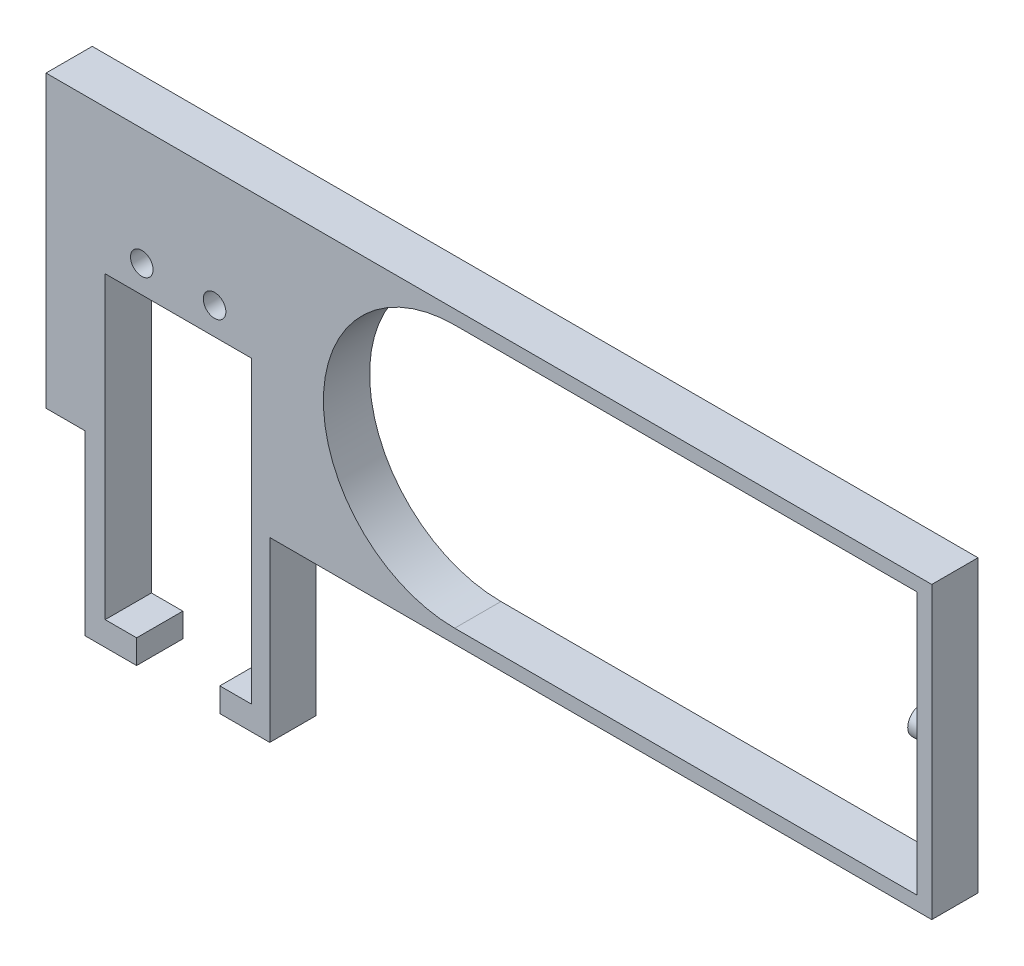
ISO-10303-21;
HEADER;
FILE_DESCRIPTION(('STEP AP214'),'2;1');
FILE_NAME('part.step','',(''),(''),'','','');
FILE_SCHEMA(('AUTOMOTIVE_DESIGN { 1 0 10303 214 1 1 1 1 }'));
ENDSEC;
DATA;
#1=APPLICATION_CONTEXT('core data for automotive mechanical design processes');
#2=APPLICATION_PROTOCOL_DEFINITION('international standard','automotive_design',2000,#1);
#3=PRODUCT_CONTEXT('',#1,'mechanical');
#4=PRODUCT('Part','Part','',(#3));
#5=PRODUCT_RELATED_PRODUCT_CATEGORY('part','',(#4));
#6=PRODUCT_DEFINITION_FORMATION('','',#4);
#7=PRODUCT_DEFINITION_CONTEXT('part definition',#1,'design');
#8=PRODUCT_DEFINITION('design','',#6,#7);
#9=PRODUCT_DEFINITION_SHAPE('','',#8);
#10=(LENGTH_UNIT() NAMED_UNIT(*) SI_UNIT(.MILLI.,.METRE.));
#11=(NAMED_UNIT(*) PLANE_ANGLE_UNIT() SI_UNIT($,.RADIAN.));
#12=(NAMED_UNIT(*) SI_UNIT($,.STERADIAN.) SOLID_ANGLE_UNIT());
#13=UNCERTAINTY_MEASURE_WITH_UNIT(LENGTH_MEASURE(1.E-05),#10,'distance_accuracy_value','');
#14=(GEOMETRIC_REPRESENTATION_CONTEXT(3) GLOBAL_UNCERTAINTY_ASSIGNED_CONTEXT((#13)) GLOBAL_UNIT_ASSIGNED_CONTEXT((#10,
#11,#12)) REPRESENTATION_CONTEXT('',''));
#15=CARTESIAN_POINT('',(0.,0.,0.));
#16=DIRECTION('',(0.,0.,1.));
#17=DIRECTION('',(1.,0.,0.));
#18=AXIS2_PLACEMENT_3D('',#15,#16,#17);
#19=CARTESIAN_POINT('',(203.2,-44.323,-51.1953367016958));
#20=DIRECTION('',(0.,-1.,0.));
#21=DIRECTION('',(0.,0.,-1.));
#22=AXIS2_PLACEMENT_3D('',#19,#20,#21);
#23=PLANE('',#22);
#24=DIRECTION('',(0.,0.,1.));
#25=VECTOR('',#24,1.);
#26=CARTESIAN_POINT('',(210.312,-44.323,0.));
#27=LINE('',#26,#25);
#28=CARTESIAN_POINT('',(210.312,-44.323,0.));
#29=VERTEX_POINT('',#28);
#30=CARTESIAN_POINT('',(210.312,-44.323,6.35));
#31=VERTEX_POINT('',#30);
#32=EDGE_CURVE('E237',#29,#31,#27,.T.);
#33=ORIENTED_EDGE('',*,*,#32,.T.);
#34=DIRECTION('',(1.,0.,0.));
#35=VECTOR('',#34,1.);
#36=CARTESIAN_POINT('',(203.2,-44.323,6.35));
#37=LINE('',#36,#35);
#38=CARTESIAN_POINT('',(203.2,-44.323,6.35));
#39=VERTEX_POINT('',#38);
#40=EDGE_CURVE('E304',#39,#31,#37,.T.);
#41=ORIENTED_EDGE('',*,*,#40,.F.);
#42=DIRECTION('',(0.,0.,1.));
#43=VECTOR('',#42,1.);
#44=CARTESIAN_POINT('',(203.2,-44.323,-51.1953367016958));
#45=LINE('',#44,#43);
#46=CARTESIAN_POINT('',(203.2,-44.323,0.));
#47=VERTEX_POINT('',#46);
#48=EDGE_CURVE('E309',#47,#39,#45,.T.);
#49=ORIENTED_EDGE('',*,*,#48,.F.);
#50=DIRECTION('',(-1.,0.,0.));
#51=VECTOR('',#50,1.);
#52=CARTESIAN_POINT('',(203.2,-44.323,0.));
#53=LINE('',#52,#51);
#54=EDGE_CURVE('E301',#29,#47,#53,.T.);
#55=ORIENTED_EDGE('',*,*,#54,.F.);
#56=EDGE_LOOP('',(#33,#41,#49,#55));
#57=FACE_BOUND('',#56,.T.);
#58=ADVANCED_FACE('F37',(#57),#23,.T.);
#59=CARTESIAN_POINT('',(226.06,-41.021,0.));
#60=DIRECTION('',(0.,-1.,0.));
#61=DIRECTION('',(0.,0.,-1.));
#62=AXIS2_PLACEMENT_3D('',#59,#60,#61);
#63=PLANE('',#62);
#64=DIRECTION('',(1.,0.,0.));
#65=VECTOR('',#64,1.);
#66=CARTESIAN_POINT('',(226.06,-41.021,6.35));
#67=LINE('',#66,#65);
#68=CARTESIAN_POINT('',(205.994,-41.021,6.35));
#69=VERTEX_POINT('',#68);
#70=CARTESIAN_POINT('',(210.312,-41.021,6.35));
#71=VERTEX_POINT('',#70);
#72=EDGE_CURVE('E266',#69,#71,#67,.T.);
#73=ORIENTED_EDGE('',*,*,#72,.T.);
#74=DIRECTION('',(0.,0.,1.));
#75=VECTOR('',#74,1.);
#76=CARTESIAN_POINT('',(210.312,-41.021,0.));
#77=LINE('',#76,#75);
#78=CARTESIAN_POINT('',(210.312,-41.021,0.));
#79=VERTEX_POINT('',#78);
#80=EDGE_CURVE('E240',#79,#71,#77,.T.);
#81=ORIENTED_EDGE('',*,*,#80,.F.);
#82=DIRECTION('',(1.,0.,0.));
#83=VECTOR('',#82,1.);
#84=CARTESIAN_POINT('',(226.06,-41.021,0.));
#85=LINE('',#84,#83);
#86=CARTESIAN_POINT('',(205.994,-41.021,0.));
#87=VERTEX_POINT('',#86);
#88=EDGE_CURVE('E273',#87,#79,#85,.T.);
#89=ORIENTED_EDGE('',*,*,#88,.F.);
#90=DIRECTION('',(0.,0.,1.));
#91=VECTOR('',#90,1.);
#92=CARTESIAN_POINT('',(205.994,-41.021,0.));
#93=LINE('',#92,#91);
#94=EDGE_CURVE('E290',#87,#69,#93,.T.);
#95=ORIENTED_EDGE('',*,*,#94,.T.);
#96=EDGE_LOOP('',(#73,#81,#89,#95));
#97=FACE_BOUND('',#96,.T.);
#98=ADVANCED_FACE('F387',(#97),#63,.F.);
#99=CARTESIAN_POINT('',(127.,-19.939,6.34999999999999));
#100=DIRECTION('',(0.,1.,0.));
#101=DIRECTION('',(0.,0.,1.));
#102=AXIS2_PLACEMENT_3D('',#99,#100,#101);
#103=PLANE('',#102);
#104=DIRECTION('',(-1.,0.,0.));
#105=VECTOR('',#104,1.);
#106=CARTESIAN_POINT('',(127.,-19.939,6.34999999999999));
#107=LINE('',#106,#105);
#108=CARTESIAN_POINT('',(203.2,-19.939,6.35));
#109=VERTEX_POINT('',#108);
#110=CARTESIAN_POINT('',(197.866,-19.939,6.35));
#111=VERTEX_POINT('',#110);
#112=EDGE_CURVE('E194',#109,#111,#107,.T.);
#113=ORIENTED_EDGE('',*,*,#112,.T.);
#114=DIRECTION('',(0.,0.,-1.));
#115=VECTOR('',#114,1.);
#116=CARTESIAN_POINT('',(197.866,-19.939,6.34999999999999));
#117=LINE('',#116,#115);
#118=CARTESIAN_POINT('',(197.866,-19.939,0.));
#119=VERTEX_POINT('',#118);
#120=EDGE_CURVE('E223',#111,#119,#117,.T.);
#121=ORIENTED_EDGE('',*,*,#120,.T.);
#122=DIRECTION('',(-1.,0.,0.));
#123=VECTOR('',#122,1.);
#124=CARTESIAN_POINT('',(127.,-19.939,0.));
#125=LINE('',#124,#123);
#126=CARTESIAN_POINT('',(203.2,-19.939,0.));
#127=VERTEX_POINT('',#126);
#128=EDGE_CURVE('E195',#127,#119,#125,.T.);
#129=ORIENTED_EDGE('',*,*,#128,.F.);
#130=DIRECTION('',(0.,0.,1.));
#131=VECTOR('',#130,1.);
#132=CARTESIAN_POINT('',(203.2,-19.939,6.34999999999999));
#133=LINE('',#132,#131);
#134=EDGE_CURVE('E45',#127,#109,#133,.T.);
#135=ORIENTED_EDGE('',*,*,#134,.T.);
#136=EDGE_LOOP('',(#113,#121,#129,#135));
#137=FACE_BOUND('',#136,.T.);
#138=ADVANCED_FACE('F208',(#137),#103,.F.);
#139=CARTESIAN_POINT('',(0.,0.,6.35));
#140=DIRECTION('',(0.,0.,1.));
#141=DIRECTION('',(1.,0.,0.));
#142=AXIS2_PLACEMENT_3D('',#139,#140,#141);
#143=PLANE('',#142);
#144=DIRECTION('',(0.,1.,0.));
#145=VECTOR('',#144,1.);
#146=CARTESIAN_POINT('',(197.866,33.0005445781988,6.35));
#147=LINE('',#146,#145);
#148=CARTESIAN_POINT('',(197.866,19.939,6.35));
#149=VERTEX_POINT('',#148);
#150=EDGE_CURVE('E52',#111,#149,#147,.T.);
#151=ORIENTED_EDGE('',*,*,#150,.F.);
#152=ORIENTED_EDGE('',*,*,#112,.F.);
#153=DIRECTION('',(0.,-1.,0.));
#154=VECTOR('',#153,1.);
#155=CARTESIAN_POINT('',(203.2,0.126999999999995,6.35));
#156=LINE('',#155,#154);
#157=EDGE_CURVE('E216',#109,#39,#156,.T.);
#158=ORIENTED_EDGE('',*,*,#157,.T.);
#159=ORIENTED_EDGE('',*,*,#40,.T.);
#160=DIRECTION('',(0.,-1.,0.));
#161=VECTOR('',#160,1.);
#162=CARTESIAN_POINT('',(210.312,-41.021,6.35));
#163=LINE('',#162,#161);
#164=EDGE_CURVE('E229',#71,#31,#163,.T.);
#165=ORIENTED_EDGE('',*,*,#164,.F.);
#166=ORIENTED_EDGE('',*,*,#72,.F.);
#167=DIRECTION('',(0.,-1.,0.));
#168=VECTOR('',#167,1.);
#169=CARTESIAN_POINT('',(205.994,-41.021,6.35));
#170=LINE('',#169,#168);
#171=CARTESIAN_POINT('',(205.994,0.126999999999995,6.35));
#172=VERTEX_POINT('',#171);
#173=EDGE_CURVE('E281',#172,#69,#170,.T.);
#174=ORIENTED_EDGE('',*,*,#173,.F.);
#175=DIRECTION('',(-1.,0.,0.));
#176=VECTOR('',#175,1.);
#177=CARTESIAN_POINT('',(226.06,0.126999999999998,6.35));
#178=LINE('',#177,#176);
#179=CARTESIAN_POINT('',(226.06,0.126999999999998,6.35));
#180=VERTEX_POINT('',#179);
#181=EDGE_CURVE('E278',#180,#172,#178,.T.);
#182=ORIENTED_EDGE('',*,*,#181,.F.);
#183=DIRECTION('',(0.,1.,0.));
#184=VECTOR('',#183,1.);
#185=CARTESIAN_POINT('',(226.06,-41.021,6.35));
#186=LINE('',#185,#184);
#187=CARTESIAN_POINT('',(226.06,-41.021,6.35));
#188=VERTEX_POINT('',#187);
#189=EDGE_CURVE('E253',#188,#180,#186,.T.);
#190=ORIENTED_EDGE('',*,*,#189,.F.);
#191=CARTESIAN_POINT('',(221.742,-41.021,6.35));
#192=VERTEX_POINT('',#191);
#193=EDGE_CURVE('E284',#192,#188,#67,.T.);
#194=ORIENTED_EDGE('',*,*,#193,.F.);
#195=DIRECTION('',(0.,1.,0.));
#196=VECTOR('',#195,1.);
#197=CARTESIAN_POINT('',(221.742,-41.021,6.35));
#198=LINE('',#197,#196);
#199=CARTESIAN_POINT('',(221.742,-44.323,6.35));
#200=VERTEX_POINT('',#199);
#201=EDGE_CURVE('E234',#200,#192,#198,.T.);
#202=ORIENTED_EDGE('',*,*,#201,.F.);
#203=CARTESIAN_POINT('',(228.6,-44.323,6.35));
#204=VERTEX_POINT('',#203);
#205=EDGE_CURVE('E303',#200,#204,#37,.T.);
#206=ORIENTED_EDGE('',*,*,#205,.T.);
#207=DIRECTION('',(0.,1.,0.));
#208=VECTOR('',#207,1.);
#209=CARTESIAN_POINT('',(228.6,0.126999999999995,6.35));
#210=LINE('',#209,#208);
#211=CARTESIAN_POINT('',(228.6,-19.939,6.35));
#212=VERTEX_POINT('',#211);
#213=EDGE_CURVE('E306',#204,#212,#210,.T.);
#214=ORIENTED_EDGE('',*,*,#213,.T.);
#215=CARTESIAN_POINT('',(319.532,-19.939,6.35));
#216=VERTEX_POINT('',#215);
#217=EDGE_CURVE('E198',#216,#212,#107,.T.);
#218=ORIENTED_EDGE('',*,*,#217,.F.);
#219=DIRECTION('',(0.,-1.,0.));
#220=VECTOR('',#219,1.);
#221=CARTESIAN_POINT('',(319.532,19.939,6.35));
#222=LINE('',#221,#220);
#223=CARTESIAN_POINT('',(319.532,19.939,6.35));
#224=VERTEX_POINT('',#223);
#225=EDGE_CURVE('E174',#224,#216,#222,.T.);
#226=ORIENTED_EDGE('',*,*,#225,.F.);
#227=DIRECTION('',(-1.,0.,0.));
#228=VECTOR('',#227,1.);
#229=CARTESIAN_POINT('',(127.,19.939,6.35));
#230=LINE('',#229,#228);
#231=EDGE_CURVE('E220',#224,#149,#230,.T.);
#232=ORIENTED_EDGE('',*,*,#231,.T.);
#233=EDGE_LOOP('',(#151,#152,#158,#159,#165,#166,#174,#182,#190,#194,#202,#206,#214,#218,#226,#232));
#234=FACE_BOUND('',#233,.T.);
#235=CARTESIAN_POINT('',(211.021,3.88000000000004,6.35));
#236=DIRECTION('',(0.,0.,-1.));
#237=DIRECTION('',(-1.,0.,0.));
#238=AXIS2_PLACEMENT_3D('',#235,#236,#237);
#239=CIRCLE('',#238,1.54999999999999);
#240=CARTESIAN_POINT('',(209.471,3.88000000000004,6.35));
#241=VERTEX_POINT('',#240);
#242=EDGE_CURVE('E250',#241,#241,#239,.T.);
#243=ORIENTED_EDGE('',*,*,#242,.T.);
#244=EDGE_LOOP('',(#243));
#245=FACE_BOUND('',#244,.T.);
#246=CARTESIAN_POINT('',(221.021,3.88000000000004,6.35));
#247=DIRECTION('',(0.,0.,-1.));
#248=DIRECTION('',(-1.,0.,0.));
#249=AXIS2_PLACEMENT_3D('',#246,#247,#248);
#250=CIRCLE('',#249,1.54999999999999);
#251=CARTESIAN_POINT('',(219.471,3.88000000000004,6.35));
#252=VERTEX_POINT('',#251);
#253=EDGE_CURVE('E257',#252,#252,#250,.T.);
#254=ORIENTED_EDGE('',*,*,#253,.T.);
#255=EDGE_LOOP('',(#254));
#256=FACE_BOUND('',#255,.T.);
#257=DIRECTION('',(-1.,0.,0.));
#258=VECTOR('',#257,1.);
#259=CARTESIAN_POINT('',(254.,18.034,6.35));
#260=LINE('',#259,#258);
#261=CARTESIAN_POINT('',(317.5,18.034,6.35));
#262=VERTEX_POINT('',#261);
#263=CARTESIAN_POINT('',(254.,18.034,6.35));
#264=VERTEX_POINT('',#263);
#265=EDGE_CURVE('E331',#262,#264,#260,.T.);
#266=ORIENTED_EDGE('',*,*,#265,.F.);
#267=DIRECTION('',(0.,-1.,0.));
#268=VECTOR('',#267,1.);
#269=CARTESIAN_POINT('',(317.5,18.034,6.35));
#270=LINE('',#269,#268);
#271=CARTESIAN_POINT('',(317.5,-18.034,6.35));
#272=VERTEX_POINT('',#271);
#273=EDGE_CURVE('E320',#262,#272,#270,.T.);
#274=ORIENTED_EDGE('',*,*,#273,.T.);
#275=DIRECTION('',(1.,0.,0.));
#276=VECTOR('',#275,1.);
#277=CARTESIAN_POINT('',(254.,-18.034,6.35));
#278=LINE('',#277,#276);
#279=CARTESIAN_POINT('',(254.,-18.034,6.35));
#280=VERTEX_POINT('',#279);
#281=EDGE_CURVE('E337',#280,#272,#278,.T.);
#282=ORIENTED_EDGE('',*,*,#281,.F.);
#283=CARTESIAN_POINT('',(254.,0.,6.35));
#284=DIRECTION('',(0.,0.,1.));
#285=DIRECTION('',(1.,0.,0.));
#286=AXIS2_PLACEMENT_3D('',#283,#284,#285);
#287=CIRCLE('',#286,18.034);
#288=EDGE_CURVE('E345',#264,#280,#287,.T.);
#289=ORIENTED_EDGE('',*,*,#288,.F.);
#290=EDGE_LOOP('',(#266,#274,#282,#289));
#291=FACE_BOUND('',#290,.T.);
#292=ADVANCED_FACE('F213',(#234,#245,#256,#291),#143,.T.);
#293=CARTESIAN_POINT('',(0.,0.,0.));
#294=DIRECTION('',(0.,0.,1.));
#295=DIRECTION('',(1.,0.,0.));
#296=AXIS2_PLACEMENT_3D('',#293,#294,#295);
#297=PLANE('',#296);
#298=CARTESIAN_POINT('',(211.021,3.88000000000004,0.));
#299=DIRECTION('',(0.,0.,-1.));
#300=DIRECTION('',(-1.,0.,0.));
#301=AXIS2_PLACEMENT_3D('',#298,#299,#300);
#302=CIRCLE('',#301,1.54999999999999);
#303=CARTESIAN_POINT('',(209.471,3.88000000000004,0.));
#304=VERTEX_POINT('',#303);
#305=EDGE_CURVE('E254',#304,#304,#302,.T.);
#306=ORIENTED_EDGE('',*,*,#305,.F.);
#307=EDGE_LOOP('',(#306));
#308=FACE_BOUND('',#307,.T.);
#309=CARTESIAN_POINT('',(221.021,3.88000000000004,0.));
#310=DIRECTION('',(0.,0.,-1.));
#311=DIRECTION('',(-1.,0.,0.));
#312=AXIS2_PLACEMENT_3D('',#309,#310,#311);
#313=CIRCLE('',#312,1.54999999999999);
#314=CARTESIAN_POINT('',(219.471,3.88000000000004,0.));
#315=VERTEX_POINT('',#314);
#316=EDGE_CURVE('E242',#315,#315,#313,.T.);
#317=ORIENTED_EDGE('',*,*,#316,.F.);
#318=EDGE_LOOP('',(#317));
#319=FACE_BOUND('',#318,.T.);
#320=ORIENTED_EDGE('',*,*,#128,.T.);
#321=DIRECTION('',(0.,1.,0.));
#322=VECTOR('',#321,1.);
#323=CARTESIAN_POINT('',(197.866,33.0005445781988,0.));
#324=LINE('',#323,#322);
#325=CARTESIAN_POINT('',(197.866,19.939,0.));
#326=VERTEX_POINT('',#325);
#327=EDGE_CURVE('E221',#119,#326,#324,.T.);
#328=ORIENTED_EDGE('',*,*,#327,.T.);
#329=DIRECTION('',(-1.,0.,0.));
#330=VECTOR('',#329,1.);
#331=CARTESIAN_POINT('',(127.,19.939,0.));
#332=LINE('',#331,#330);
#333=CARTESIAN_POINT('',(319.532,19.939,0.));
#334=VERTEX_POINT('',#333);
#335=EDGE_CURVE('E188',#334,#326,#332,.T.);
#336=ORIENTED_EDGE('',*,*,#335,.F.);
#337=DIRECTION('',(0.,-1.,0.));
#338=VECTOR('',#337,1.);
#339=CARTESIAN_POINT('',(319.532,19.939,0.));
#340=LINE('',#339,#338);
#341=CARTESIAN_POINT('',(319.532,-19.939,0.));
#342=VERTEX_POINT('',#341);
#343=EDGE_CURVE('E59',#334,#342,#340,.T.);
#344=ORIENTED_EDGE('',*,*,#343,.T.);
#345=CARTESIAN_POINT('',(228.6,-19.939,0.));
#346=VERTEX_POINT('',#345);
#347=EDGE_CURVE('E184',#342,#346,#125,.T.);
#348=ORIENTED_EDGE('',*,*,#347,.T.);
#349=DIRECTION('',(0.,-1.,0.));
#350=VECTOR('',#349,1.);
#351=CARTESIAN_POINT('',(228.6,0.126999999999995,0.));
#352=LINE('',#351,#350);
#353=CARTESIAN_POINT('',(228.6,-44.323,0.));
#354=VERTEX_POINT('',#353);
#355=EDGE_CURVE('E296',#346,#354,#352,.T.);
#356=ORIENTED_EDGE('',*,*,#355,.T.);
#357=CARTESIAN_POINT('',(221.742,-44.323,0.));
#358=VERTEX_POINT('',#357);
#359=EDGE_CURVE('E313',#354,#358,#53,.T.);
#360=ORIENTED_EDGE('',*,*,#359,.T.);
#361=DIRECTION('',(0.,1.,0.));
#362=VECTOR('',#361,1.);
#363=CARTESIAN_POINT('',(221.742,-41.021,0.));
#364=LINE('',#363,#362);
#365=CARTESIAN_POINT('',(221.742,-41.021,0.));
#366=VERTEX_POINT('',#365);
#367=EDGE_CURVE('E233',#358,#366,#364,.T.);
#368=ORIENTED_EDGE('',*,*,#367,.T.);
#369=CARTESIAN_POINT('',(226.06,-41.021,0.));
#370=VERTEX_POINT('',#369);
#371=EDGE_CURVE('E272',#366,#370,#85,.T.);
#372=ORIENTED_EDGE('',*,*,#371,.T.);
#373=DIRECTION('',(0.,1.,0.));
#374=VECTOR('',#373,1.);
#375=CARTESIAN_POINT('',(226.06,-41.021,0.));
#376=LINE('',#375,#374);
#377=CARTESIAN_POINT('',(226.06,0.126999999999998,0.));
#378=VERTEX_POINT('',#377);
#379=EDGE_CURVE('E262',#370,#378,#376,.T.);
#380=ORIENTED_EDGE('',*,*,#379,.T.);
#381=DIRECTION('',(-1.,0.,0.));
#382=VECTOR('',#381,1.);
#383=CARTESIAN_POINT('',(226.06,0.126999999999998,0.));
#384=LINE('',#383,#382);
#385=CARTESIAN_POINT('',(205.994,0.126999999999995,0.));
#386=VERTEX_POINT('',#385);
#387=EDGE_CURVE('E265',#378,#386,#384,.T.);
#388=ORIENTED_EDGE('',*,*,#387,.T.);
#389=DIRECTION('',(0.,-1.,0.));
#390=VECTOR('',#389,1.);
#391=CARTESIAN_POINT('',(205.994,-41.021,0.));
#392=LINE('',#391,#390);
#393=EDGE_CURVE('E269',#386,#87,#392,.T.);
#394=ORIENTED_EDGE('',*,*,#393,.T.);
#395=ORIENTED_EDGE('',*,*,#88,.T.);
#396=DIRECTION('',(0.,-1.,0.));
#397=VECTOR('',#396,1.);
#398=CARTESIAN_POINT('',(210.312,-41.021,0.));
#399=LINE('',#398,#397);
#400=EDGE_CURVE('E230',#79,#29,#399,.T.);
#401=ORIENTED_EDGE('',*,*,#400,.T.);
#402=ORIENTED_EDGE('',*,*,#54,.T.);
#403=DIRECTION('',(0.,1.,0.));
#404=VECTOR('',#403,1.);
#405=CARTESIAN_POINT('',(203.2,0.126999999999995,0.));
#406=LINE('',#405,#404);
#407=EDGE_CURVE('E298',#47,#127,#406,.T.);
#408=ORIENTED_EDGE('',*,*,#407,.T.);
#409=EDGE_LOOP('',(#320,#328,#336,#344,#348,#356,#360,#368,#372,#380,#388,#394,#395,#401,#402,#408));
#410=FACE_BOUND('',#409,.T.);
#411=DIRECTION('',(0.,-1.,0.));
#412=VECTOR('',#411,1.);
#413=CARTESIAN_POINT('',(317.5,18.034,0.));
#414=LINE('',#413,#412);
#415=CARTESIAN_POINT('',(317.5,18.034,0.));
#416=VERTEX_POINT('',#415);
#417=CARTESIAN_POINT('',(317.5,-18.034,0.));
#418=VERTEX_POINT('',#417);
#419=EDGE_CURVE('E323',#416,#418,#414,.T.);
#420=ORIENTED_EDGE('',*,*,#419,.F.);
#421=DIRECTION('',(-1.,0.,0.));
#422=VECTOR('',#421,1.);
#423=CARTESIAN_POINT('',(254.,18.034,0.));
#424=LINE('',#423,#422);
#425=CARTESIAN_POINT('',(254.,18.034,0.));
#426=VERTEX_POINT('',#425);
#427=EDGE_CURVE('E334',#416,#426,#424,.T.);
#428=ORIENTED_EDGE('',*,*,#427,.T.);
#429=CARTESIAN_POINT('',(254.,0.,0.));
#430=DIRECTION('',(0.,0.,1.));
#431=DIRECTION('',(1.,0.,0.));
#432=AXIS2_PLACEMENT_3D('',#429,#430,#431);
#433=CIRCLE('',#432,18.034);
#434=CARTESIAN_POINT('',(254.,-18.034,0.));
#435=VERTEX_POINT('',#434);
#436=EDGE_CURVE('E348',#426,#435,#433,.T.);
#437=ORIENTED_EDGE('',*,*,#436,.T.);
#438=DIRECTION('',(1.,0.,0.));
#439=VECTOR('',#438,1.);
#440=CARTESIAN_POINT('',(254.,-18.034,0.));
#441=LINE('',#440,#439);
#442=EDGE_CURVE('E336',#435,#418,#441,.T.);
#443=ORIENTED_EDGE('',*,*,#442,.T.);
#444=EDGE_LOOP('',(#420,#428,#437,#443));
#445=FACE_BOUND('',#444,.T.);
#446=ADVANCED_FACE('F39',(#308,#319,#410,#445),#297,.F.);
#447=ORIENTED_EDGE('',*,*,#347,.F.);
#448=DIRECTION('',(0.,0.,1.));
#449=VECTOR('',#448,1.);
#450=CARTESIAN_POINT('',(319.532,-19.939,0.));
#451=LINE('',#450,#449);
#452=EDGE_CURVE('E171',#342,#216,#451,.T.);
#453=ORIENTED_EDGE('',*,*,#452,.T.);
#454=ORIENTED_EDGE('',*,*,#217,.T.);
#455=DIRECTION('',(0.,0.,-1.));
#456=VECTOR('',#455,1.);
#457=CARTESIAN_POINT('',(228.6,-19.939,6.34999999999999));
#458=LINE('',#457,#456);
#459=EDGE_CURVE('E193',#212,#346,#458,.T.);
#460=ORIENTED_EDGE('',*,*,#459,.T.);
#461=EDGE_LOOP('',(#447,#453,#454,#460));
#462=FACE_BOUND('',#461,.T.);
#463=ADVANCED_FACE('F191',(#462),#103,.F.);
#464=CARTESIAN_POINT('',(127.,19.939,6.35));
#465=DIRECTION('',(0.,-1.,0.));
#466=DIRECTION('',(0.,0.,-1.));
#467=AXIS2_PLACEMENT_3D('',#464,#465,#466);
#468=PLANE('',#467);
#469=ORIENTED_EDGE('',*,*,#335,.T.);
#470=DIRECTION('',(0.,0.,1.));
#471=VECTOR('',#470,1.);
#472=CARTESIAN_POINT('',(197.866,19.939,6.35));
#473=LINE('',#472,#471);
#474=EDGE_CURVE('E11',#326,#149,#473,.T.);
#475=ORIENTED_EDGE('',*,*,#474,.T.);
#476=ORIENTED_EDGE('',*,*,#231,.F.);
#477=DIRECTION('',(0.,0.,1.));
#478=VECTOR('',#477,1.);
#479=CARTESIAN_POINT('',(319.532,19.939,0.));
#480=LINE('',#479,#478);
#481=EDGE_CURVE('E178',#334,#224,#480,.T.);
#482=ORIENTED_EDGE('',*,*,#481,.F.);
#483=EDGE_LOOP('',(#469,#475,#476,#482));
#484=FACE_BOUND('',#483,.T.);
#485=ADVANCED_FACE('F353',(#484),#468,.F.);
#486=CARTESIAN_POINT('',(254.,0.,0.));
#487=DIRECTION('',(0.,0.,1.));
#488=DIRECTION('',(1.,0.,0.));
#489=AXIS2_PLACEMENT_3D('',#486,#487,#488);
#490=CYLINDRICAL_SURFACE('',#489,18.034);
#491=ORIENTED_EDGE('',*,*,#288,.T.);
#492=DIRECTION('',(0.,0.,1.));
#493=VECTOR('',#492,1.);
#494=CARTESIAN_POINT('',(254.,-18.034,0.));
#495=LINE('',#494,#493);
#496=EDGE_CURVE('E343',#435,#280,#495,.T.);
#497=ORIENTED_EDGE('',*,*,#496,.F.);
#498=ORIENTED_EDGE('',*,*,#436,.F.);
#499=DIRECTION('',(0.,0.,1.));
#500=VECTOR('',#499,1.);
#501=CARTESIAN_POINT('',(254.,18.034,0.));
#502=LINE('',#501,#500);
#503=EDGE_CURVE('E340',#426,#264,#502,.T.);
#504=ORIENTED_EDGE('',*,*,#503,.T.);
#505=EDGE_LOOP('',(#491,#497,#498,#504));
#506=FACE_BOUND('',#505,.T.);
#507=ADVANCED_FACE('F464',(#506),#490,.F.);
#508=CARTESIAN_POINT('',(254.,18.034,0.));
#509=DIRECTION('',(0.,1.,0.));
#510=DIRECTION('',(0.,0.,1.));
#511=AXIS2_PLACEMENT_3D('',#508,#509,#510);
#512=PLANE('',#511);
#513=ORIENTED_EDGE('',*,*,#427,.F.);
#514=DIRECTION('',(0.,0.,1.));
#515=VECTOR('',#514,1.);
#516=CARTESIAN_POINT('',(317.5,18.034,0.));
#517=LINE('',#516,#515);
#518=EDGE_CURVE('E329',#416,#262,#517,.T.);
#519=ORIENTED_EDGE('',*,*,#518,.T.);
#520=ORIENTED_EDGE('',*,*,#265,.T.);
#521=ORIENTED_EDGE('',*,*,#503,.F.);
#522=EDGE_LOOP('',(#513,#519,#520,#521));
#523=FACE_BOUND('',#522,.T.);
#524=ADVANCED_FACE('F596',(#523),#512,.F.);
#525=CARTESIAN_POINT('',(254.,-18.034,0.));
#526=DIRECTION('',(0.,-1.,0.));
#527=DIRECTION('',(0.,0.,-1.));
#528=AXIS2_PLACEMENT_3D('',#525,#526,#527);
#529=PLANE('',#528);
#530=ORIENTED_EDGE('',*,*,#281,.T.);
#531=DIRECTION('',(0.,0.,1.));
#532=VECTOR('',#531,1.);
#533=CARTESIAN_POINT('',(317.5,-18.034,0.));
#534=LINE('',#533,#532);
#535=EDGE_CURVE('E326',#418,#272,#534,.T.);
#536=ORIENTED_EDGE('',*,*,#535,.F.);
#537=ORIENTED_EDGE('',*,*,#442,.F.);
#538=ORIENTED_EDGE('',*,*,#496,.T.);
#539=EDGE_LOOP('',(#530,#536,#537,#538));
#540=FACE_BOUND('',#539,.T.);
#541=ADVANCED_FACE('F586',(#540),#529,.F.);
#542=CARTESIAN_POINT('',(317.5,18.034,0.));
#543=DIRECTION('',(-1.,0.,0.));
#544=DIRECTION('',(0.,0.,1.));
#545=AXIS2_PLACEMENT_3D('',#542,#543,#544);
#546=PLANE('',#545);
#547=CARTESIAN_POINT('',(317.5,0.,3.175));
#548=DIRECTION('',(-1.,0.,0.));
#549=DIRECTION('',(0.,0.,1.));
#550=AXIS2_PLACEMENT_3D('',#547,#548,#549);
#551=CIRCLE('',#550,1.905);
#552=CARTESIAN_POINT('',(317.5,0.,5.08));
#553=VERTEX_POINT('',#552);
#554=EDGE_CURVE('E316',#553,#553,#551,.T.);
#555=ORIENTED_EDGE('',*,*,#554,.F.);
#556=EDGE_LOOP('',(#555));
#557=FACE_BOUND('',#556,.T.);
#558=ORIENTED_EDGE('',*,*,#273,.F.);
#559=ORIENTED_EDGE('',*,*,#518,.F.);
#560=ORIENTED_EDGE('',*,*,#419,.T.);
#561=ORIENTED_EDGE('',*,*,#535,.T.);
#562=EDGE_LOOP('',(#558,#559,#560,#561));
#563=FACE_BOUND('',#562,.T.);
#564=ADVANCED_FACE('F576',(#557,#563),#546,.T.);
#565=CARTESIAN_POINT('',(314.96,0.,3.175));
#566=DIRECTION('',(1.,0.,0.));
#567=DIRECTION('',(0.,0.,-1.));
#568=AXIS2_PLACEMENT_3D('',#565,#566,#567);
#569=CYLINDRICAL_SURFACE('',#568,1.905);
#570=CARTESIAN_POINT('',(314.96,0.,3.175));
#571=DIRECTION('',(-1.,0.,0.));
#572=DIRECTION('',(0.,0.,1.));
#573=AXIS2_PLACEMENT_3D('',#570,#571,#572);
#574=CIRCLE('',#573,1.905);
#575=CARTESIAN_POINT('',(314.96,0.,5.08));
#576=VERTEX_POINT('',#575);
#577=EDGE_CURVE('E317',#576,#576,#574,.T.);
#578=ORIENTED_EDGE('',*,*,#577,.F.);
#579=EDGE_LOOP('',(#578));
#580=FACE_BOUND('',#579,.T.);
#581=ORIENTED_EDGE('',*,*,#554,.T.);
#582=EDGE_LOOP('',(#581));
#583=FACE_BOUND('',#582,.T.);
#584=ADVANCED_FACE('F565',(#580,#583),#569,.T.);
#585=CARTESIAN_POINT('',(314.96,0.,3.175));
#586=DIRECTION('',(-1.,0.,0.));
#587=DIRECTION('',(0.,0.,1.));
#588=AXIS2_PLACEMENT_3D('',#585,#586,#587);
#589=PLANE('',#588);
#590=ORIENTED_EDGE('',*,*,#577,.T.);
#591=EDGE_LOOP('',(#590));
#592=FACE_BOUND('',#591,.T.);
#593=ADVANCED_FACE('F419',(#592),#589,.T.);
#594=CARTESIAN_POINT('',(203.2,0.126999999999995,-51.1953367016958));
#595=DIRECTION('',(-1.,0.,0.));
#596=DIRECTION('',(0.,0.,1.));
#597=AXIS2_PLACEMENT_3D('',#594,#595,#596);
#598=PLANE('',#597);
#599=ORIENTED_EDGE('',*,*,#134,.F.);
#600=ORIENTED_EDGE('',*,*,#407,.F.);
#601=ORIENTED_EDGE('',*,*,#48,.T.);
#602=ORIENTED_EDGE('',*,*,#157,.F.);
#603=EDGE_LOOP('',(#599,#600,#601,#602));
#604=FACE_BOUND('',#603,.T.);
#605=ADVANCED_FACE('F393',(#604),#598,.T.);
#606=CARTESIAN_POINT('',(228.6,0.126999999999995,-51.1953367016958));
#607=DIRECTION('',(1.,0.,0.));
#608=DIRECTION('',(0.,1.,0.));
#609=AXIS2_PLACEMENT_3D('',#606,#607,#608);
#610=PLANE('',#609);
#611=ORIENTED_EDGE('',*,*,#459,.F.);
#612=ORIENTED_EDGE('',*,*,#213,.F.);
#613=DIRECTION('',(0.,0.,1.));
#614=VECTOR('',#613,1.);
#615=CARTESIAN_POINT('',(228.6,-44.323,-51.1953367016958));
#616=LINE('',#615,#614);
#617=EDGE_CURVE('E299',#354,#204,#616,.T.);
#618=ORIENTED_EDGE('',*,*,#617,.F.);
#619=ORIENTED_EDGE('',*,*,#355,.F.);
#620=EDGE_LOOP('',(#611,#612,#618,#619));
#621=FACE_BOUND('',#620,.T.);
#622=ADVANCED_FACE('F356',(#621),#610,.T.);
#623=DIRECTION('',(0.,0.,1.));
#624=VECTOR('',#623,1.);
#625=CARTESIAN_POINT('',(221.742,-44.323,0.));
#626=LINE('',#625,#624);
#627=EDGE_CURVE('E246',#358,#200,#626,.T.);
#628=ORIENTED_EDGE('',*,*,#627,.F.);
#629=ORIENTED_EDGE('',*,*,#359,.F.);
#630=ORIENTED_EDGE('',*,*,#617,.T.);
#631=ORIENTED_EDGE('',*,*,#205,.F.);
#632=EDGE_LOOP('',(#628,#629,#630,#631));
#633=FACE_BOUND('',#632,.T.);
#634=ADVANCED_FACE('F362',(#633),#23,.T.);
#635=CARTESIAN_POINT('',(226.06,-41.021,0.));
#636=DIRECTION('',(1.,0.,0.));
#637=DIRECTION('',(0.,0.,-1.));
#638=AXIS2_PLACEMENT_3D('',#635,#636,#637);
#639=PLANE('',#638);
#640=ORIENTED_EDGE('',*,*,#189,.T.);
#641=DIRECTION('',(0.,0.,1.));
#642=VECTOR('',#641,1.);
#643=CARTESIAN_POINT('',(226.06,0.126999999999998,0.));
#644=LINE('',#643,#642);
#645=EDGE_CURVE('E276',#378,#180,#644,.T.);
#646=ORIENTED_EDGE('',*,*,#645,.F.);
#647=ORIENTED_EDGE('',*,*,#379,.F.);
#648=DIRECTION('',(0.,0.,1.));
#649=VECTOR('',#648,1.);
#650=CARTESIAN_POINT('',(226.06,-41.021,0.));
#651=LINE('',#650,#649);
#652=EDGE_CURVE('E287',#370,#188,#651,.T.);
#653=ORIENTED_EDGE('',*,*,#652,.T.);
#654=EDGE_LOOP('',(#640,#646,#647,#653));
#655=FACE_BOUND('',#654,.T.);
#656=ADVANCED_FACE('F375',(#655),#639,.F.);
#657=ORIENTED_EDGE('',*,*,#371,.F.);
#658=DIRECTION('',(0.,0.,1.));
#659=VECTOR('',#658,1.);
#660=CARTESIAN_POINT('',(221.742,-41.021,0.));
#661=LINE('',#660,#659);
#662=EDGE_CURVE('E243',#366,#192,#661,.T.);
#663=ORIENTED_EDGE('',*,*,#662,.T.);
#664=ORIENTED_EDGE('',*,*,#193,.T.);
#665=ORIENTED_EDGE('',*,*,#652,.F.);
#666=EDGE_LOOP('',(#657,#663,#664,#665));
#667=FACE_BOUND('',#666,.T.);
#668=ADVANCED_FACE('F372',(#667),#63,.F.);
#669=CARTESIAN_POINT('',(205.994,-41.021,0.));
#670=DIRECTION('',(-1.,0.,0.));
#671=DIRECTION('',(0.,0.,1.));
#672=AXIS2_PLACEMENT_3D('',#669,#670,#671);
#673=PLANE('',#672);
#674=ORIENTED_EDGE('',*,*,#173,.T.);
#675=ORIENTED_EDGE('',*,*,#94,.F.);
#676=ORIENTED_EDGE('',*,*,#393,.F.);
#677=DIRECTION('',(0.,0.,1.));
#678=VECTOR('',#677,1.);
#679=CARTESIAN_POINT('',(205.994,0.126999999999995,0.));
#680=LINE('',#679,#678);
#681=EDGE_CURVE('E292',#386,#172,#680,.T.);
#682=ORIENTED_EDGE('',*,*,#681,.T.);
#683=EDGE_LOOP('',(#674,#675,#676,#682));
#684=FACE_BOUND('',#683,.T.);
#685=ADVANCED_FACE('F382',(#684),#673,.F.);
#686=CARTESIAN_POINT('',(226.06,0.126999999999998,0.));
#687=DIRECTION('',(0.,1.,0.));
#688=DIRECTION('',(-1.,0.,0.));
#689=AXIS2_PLACEMENT_3D('',#686,#687,#688);
#690=PLANE('',#689);
#691=ORIENTED_EDGE('',*,*,#181,.T.);
#692=ORIENTED_EDGE('',*,*,#681,.F.);
#693=ORIENTED_EDGE('',*,*,#387,.F.);
#694=ORIENTED_EDGE('',*,*,#645,.T.);
#695=EDGE_LOOP('',(#691,#692,#693,#694));
#696=FACE_BOUND('',#695,.T.);
#697=ADVANCED_FACE('F379',(#696),#690,.F.);
#698=CARTESIAN_POINT('',(221.021,3.88000000000004,6.35));
#699=DIRECTION('',(0.,0.,-1.));
#700=DIRECTION('',(-1.,0.,0.));
#701=AXIS2_PLACEMENT_3D('',#698,#699,#700);
#702=CYLINDRICAL_SURFACE('',#701,1.54999999999999);
#703=ORIENTED_EDGE('',*,*,#253,.F.);
#704=EDGE_LOOP('',(#703));
#705=FACE_BOUND('',#704,.T.);
#706=ORIENTED_EDGE('',*,*,#316,.T.);
#707=EDGE_LOOP('',(#706));
#708=FACE_BOUND('',#707,.T.);
#709=ADVANCED_FACE('F423',(#705,#708),#702,.F.);
#710=CARTESIAN_POINT('',(211.021,3.88000000000004,6.35));
#711=DIRECTION('',(0.,0.,-1.));
#712=DIRECTION('',(-1.,0.,0.));
#713=AXIS2_PLACEMENT_3D('',#710,#711,#712);
#714=CYLINDRICAL_SURFACE('',#713,1.54999999999999);
#715=ORIENTED_EDGE('',*,*,#242,.F.);
#716=EDGE_LOOP('',(#715));
#717=FACE_BOUND('',#716,.T.);
#718=ORIENTED_EDGE('',*,*,#305,.T.);
#719=EDGE_LOOP('',(#718));
#720=FACE_BOUND('',#719,.T.);
#721=ADVANCED_FACE('F429',(#717,#720),#714,.F.);
#722=CARTESIAN_POINT('',(221.742,-41.021,0.));
#723=DIRECTION('',(1.,0.,0.));
#724=DIRECTION('',(0.,0.,-1.));
#725=AXIS2_PLACEMENT_3D('',#722,#723,#724);
#726=PLANE('',#725);
#727=ORIENTED_EDGE('',*,*,#201,.T.);
#728=ORIENTED_EDGE('',*,*,#662,.F.);
#729=ORIENTED_EDGE('',*,*,#367,.F.);
#730=ORIENTED_EDGE('',*,*,#627,.T.);
#731=EDGE_LOOP('',(#727,#728,#729,#730));
#732=FACE_BOUND('',#731,.T.);
#733=ADVANCED_FACE('F366',(#732),#726,.F.);
#734=CARTESIAN_POINT('',(210.312,-41.021,0.));
#735=DIRECTION('',(-1.,0.,0.));
#736=DIRECTION('',(0.,0.,1.));
#737=AXIS2_PLACEMENT_3D('',#734,#735,#736);
#738=PLANE('',#737);
#739=ORIENTED_EDGE('',*,*,#164,.T.);
#740=ORIENTED_EDGE('',*,*,#32,.F.);
#741=ORIENTED_EDGE('',*,*,#400,.F.);
#742=ORIENTED_EDGE('',*,*,#80,.T.);
#743=EDGE_LOOP('',(#739,#740,#741,#742));
#744=FACE_BOUND('',#743,.T.);
#745=ADVANCED_FACE('F400',(#744),#738,.F.);
#746=CARTESIAN_POINT('',(319.532,19.939,0.));
#747=DIRECTION('',(-1.,0.,0.));
#748=DIRECTION('',(0.,0.,1.));
#749=AXIS2_PLACEMENT_3D('',#746,#747,#748);
#750=PLANE('',#749);
#751=ORIENTED_EDGE('',*,*,#225,.T.);
#752=ORIENTED_EDGE('',*,*,#452,.F.);
#753=ORIENTED_EDGE('',*,*,#343,.F.);
#754=ORIENTED_EDGE('',*,*,#481,.T.);
#755=EDGE_LOOP('',(#751,#752,#753,#754));
#756=FACE_BOUND('',#755,.T.);
#757=ADVANCED_FACE('F172',(#756),#750,.F.);
#758=CARTESIAN_POINT('',(197.866,33.0005445781988,0.));
#759=DIRECTION('',(1.,0.,0.));
#760=DIRECTION('',(0.,0.,-1.));
#761=AXIS2_PLACEMENT_3D('',#758,#759,#760);
#762=PLANE('',#761);
#763=ORIENTED_EDGE('',*,*,#150,.T.);
#764=ORIENTED_EDGE('',*,*,#474,.F.);
#765=ORIENTED_EDGE('',*,*,#327,.F.);
#766=ORIENTED_EDGE('',*,*,#120,.F.);
#767=EDGE_LOOP('',(#763,#764,#765,#766));
#768=FACE_BOUND('',#767,.T.);
#769=ADVANCED_FACE('F394',(#768),#762,.F.);
#770=CLOSED_SHELL('',(#58,#98,#138,#292,#446,#463,#485,#507,#524,#541,#564,#584,#593,#605,#622,
#634,#656,#668,#685,#697,#709,#721,#733,#745,#757,#769));
#771=MANIFOLD_SOLID_BREP('B2',#770);
#772=ADVANCED_BREP_SHAPE_REPRESENTATION('',(#18,#771),#14);
#773=SHAPE_DEFINITION_REPRESENTATION(#9,#772);
ENDSEC;
END-ISO-10303-21;
